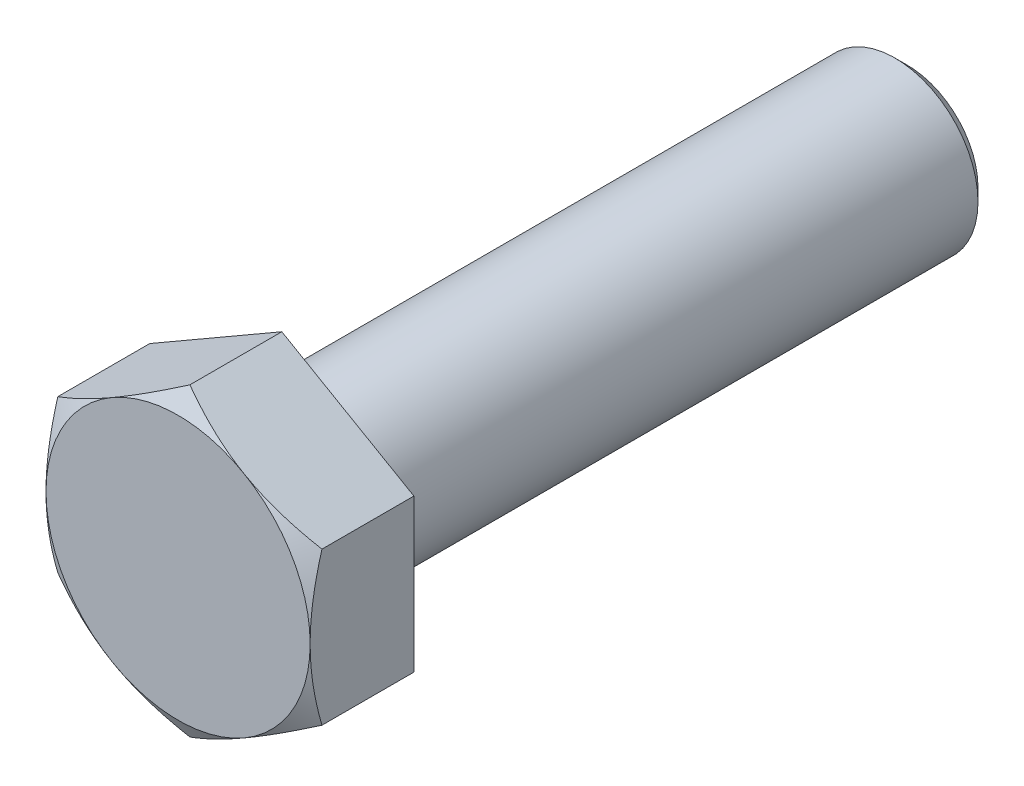
ISO-10303-21;
HEADER;
FILE_DESCRIPTION(('STEP AP214'),'2;1');
FILE_NAME('part.step','',(''),(''),'','','');
FILE_SCHEMA(('AUTOMOTIVE_DESIGN { 1 0 10303 214 1 1 1 1 }'));
ENDSEC;
DATA;
#1=APPLICATION_CONTEXT('core data for automotive mechanical design processes');
#2=APPLICATION_PROTOCOL_DEFINITION('international standard','automotive_design',2000,#1);
#3=PRODUCT_CONTEXT('',#1,'mechanical');
#4=PRODUCT('Part','Part','',(#3));
#5=PRODUCT_RELATED_PRODUCT_CATEGORY('part','',(#4));
#6=PRODUCT_DEFINITION_FORMATION('','',#4);
#7=PRODUCT_DEFINITION_CONTEXT('part definition',#1,'design');
#8=PRODUCT_DEFINITION('design','',#6,#7);
#9=PRODUCT_DEFINITION_SHAPE('','',#8);
#10=(LENGTH_UNIT() NAMED_UNIT(*) SI_UNIT(.MILLI.,.METRE.));
#11=(NAMED_UNIT(*) PLANE_ANGLE_UNIT() SI_UNIT($,.RADIAN.));
#12=(NAMED_UNIT(*) SI_UNIT($,.STERADIAN.) SOLID_ANGLE_UNIT());
#13=UNCERTAINTY_MEASURE_WITH_UNIT(LENGTH_MEASURE(1.E-05),#10,'distance_accuracy_value','');
#14=(GEOMETRIC_REPRESENTATION_CONTEXT(3) GLOBAL_UNCERTAINTY_ASSIGNED_CONTEXT((#13)) GLOBAL_UNIT_ASSIGNED_CONTEXT((#10,
#11,#12)) REPRESENTATION_CONTEXT('',''));
#15=CARTESIAN_POINT('',(0.,0.,0.));
#16=DIRECTION('',(0.,0.,1.));
#17=DIRECTION('',(1.,0.,0.));
#18=AXIS2_PLACEMENT_3D('',#15,#16,#17);
#19=CARTESIAN_POINT('',(0.,0.,0.));
#20=DIRECTION('',(0.,0.,1.));
#21=DIRECTION('',(1.,0.,0.));
#22=AXIS2_PLACEMENT_3D('',#19,#20,#21);
#23=PLANE('',#22);
#24=CARTESIAN_POINT('',(0.,0.,0.));
#25=DIRECTION('',(0.,0.,1.));
#26=DIRECTION('',(1.,0.,0.));
#27=AXIS2_PLACEMENT_3D('',#24,#25,#26);
#28=CIRCLE('',#27,4.6);
#29=CARTESIAN_POINT('',(4.6,0.,0.));
#30=VERTEX_POINT('',#29);
#31=EDGE_CURVE('E148',#30,#30,#28,.T.);
#32=ORIENTED_EDGE('',*,*,#31,.T.);
#33=EDGE_LOOP('',(#32));
#34=FACE_BOUND('',#33,.T.);
#35=CARTESIAN_POINT('',(0.,0.,0.));
#36=DIRECTION('',(0.,0.,1.));
#37=DIRECTION('',(1.,0.,0.));
#38=AXIS2_PLACEMENT_3D('',#35,#36,#37);
#39=CIRCLE('',#38,5.8);
#40=CARTESIAN_POINT('',(5.8,0.,0.));
#41=VERTEX_POINT('',#40);
#42=EDGE_CURVE('E294',#41,#41,#39,.T.);
#43=ORIENTED_EDGE('',*,*,#42,.F.);
#44=EDGE_LOOP('',(#43));
#45=FACE_BOUND('',#44,.T.);
#46=ADVANCED_FACE('F39',(#34,#45),#23,.F.);
#47=CARTESIAN_POINT('',(0.,0.,-0.6));
#48=DIRECTION('',(0.,0.,1.));
#49=DIRECTION('',(1.,0.,0.));
#50=AXIS2_PLACEMENT_3D('',#47,#48,#49);
#51=TOROIDAL_SURFACE('',#50,4.6,0.600000000000001);
#52=ORIENTED_EDGE('',*,*,#31,.F.);
#53=EDGE_LOOP('',(#52));
#54=FACE_BOUND('',#53,.T.);
#55=CARTESIAN_POINT('',(0.,0.,-0.6));
#56=DIRECTION('',(0.,0.,1.));
#57=DIRECTION('',(1.,0.,0.));
#58=AXIS2_PLACEMENT_3D('',#55,#56,#57);
#59=CIRCLE('',#58,4.);
#60=CARTESIAN_POINT('',(4.,0.,-0.6));
#61=VERTEX_POINT('',#60);
#62=EDGE_CURVE('E151',#61,#61,#59,.T.);
#63=ORIENTED_EDGE('',*,*,#62,.T.);
#64=EDGE_LOOP('',(#63));
#65=FACE_BOUND('',#64,.T.);
#66=ADVANCED_FACE('F235',(#54,#65),#51,.F.);
#67=CARTESIAN_POINT('',(0.,0.,0.));
#68=DIRECTION('',(0.,0.,1.));
#69=DIRECTION('',(1.,0.,0.));
#70=AXIS2_PLACEMENT_3D('',#67,#68,#69);
#71=CYLINDRICAL_SURFACE('',#70,4.);
#72=ORIENTED_EDGE('',*,*,#62,.F.);
#73=EDGE_LOOP('',(#72));
#74=FACE_BOUND('',#73,.T.);
#75=CARTESIAN_POINT('',(0.,0.,-29.4));
#76=DIRECTION('',(0.,0.,1.));
#77=DIRECTION('',(1.,0.,0.));
#78=AXIS2_PLACEMENT_3D('',#75,#76,#77);
#79=CIRCLE('',#78,4.);
#80=CARTESIAN_POINT('',(4.,0.,-29.4));
#81=VERTEX_POINT('',#80);
#82=EDGE_CURVE('E154',#81,#81,#79,.T.);
#83=ORIENTED_EDGE('',*,*,#82,.T.);
#84=EDGE_LOOP('',(#83));
#85=FACE_BOUND('',#84,.T.);
#86=ADVANCED_FACE('F241',(#74,#85),#71,.T.);
#87=CARTESIAN_POINT('',(0.,0.,-30.));
#88=DIRECTION('',(0.,0.,1.));
#89=DIRECTION('',(1.,0.,0.));
#90=AXIS2_PLACEMENT_3D('',#87,#88,#89);
#91=CONICAL_SURFACE('',#90,3.4,0.785398163397443);
#92=ORIENTED_EDGE('',*,*,#82,.F.);
#93=EDGE_LOOP('',(#92));
#94=FACE_BOUND('',#93,.T.);
#95=CARTESIAN_POINT('',(0.,0.,-30.));
#96=DIRECTION('',(0.,0.,1.));
#97=DIRECTION('',(1.,0.,0.));
#98=AXIS2_PLACEMENT_3D('',#95,#96,#97);
#99=CIRCLE('',#98,3.4);
#100=CARTESIAN_POINT('',(3.4,0.,-30.));
#101=VERTEX_POINT('',#100);
#102=EDGE_CURVE('E127',#101,#101,#99,.T.);
#103=ORIENTED_EDGE('',*,*,#102,.T.);
#104=EDGE_LOOP('',(#103));
#105=FACE_BOUND('',#104,.T.);
#106=ADVANCED_FACE('F308',(#94,#105),#91,.T.);
#107=CARTESIAN_POINT('',(0.,3.4,-30.));
#108=DIRECTION('',(0.,0.,1.));
#109=DIRECTION('',(1.,0.,0.));
#110=AXIS2_PLACEMENT_3D('',#107,#108,#109);
#111=PLANE('',#110);
#112=ORIENTED_EDGE('',*,*,#102,.F.);
#113=EDGE_LOOP('',(#112));
#114=FACE_BOUND('',#113,.T.);
#115=ADVANCED_FACE('F304',(#114),#111,.F.);
#116=CARTESIAN_POINT('',(0.,7.34966892678394,0.150000000000001));
#117=DIRECTION('',(0.,0.,-1.));
#118=DIRECTION('',(-1.,0.,0.));
#119=AXIS2_PLACEMENT_3D('',#116,#117,#118);
#120=PLANE('',#119);
#121=CARTESIAN_POINT('',(0.,0.,0.150000000000001));
#122=DIRECTION('',(0.,0.,1.));
#123=DIRECTION('',(1.,0.,0.));
#124=AXIS2_PLACEMENT_3D('',#121,#122,#123);
#125=CIRCLE('',#124,5.88660254037844);
#126=CARTESIAN_POINT('',(5.88660254037844,0.,0.150000000000001));
#127=VERTEX_POINT('',#126);
#128=EDGE_CURVE('E291',#127,#127,#125,.T.);
#129=ORIENTED_EDGE('',*,*,#128,.T.);
#130=EDGE_LOOP('',(#129));
#131=FACE_BOUND('',#130,.T.);
#132=DIRECTION('',(0.866025403784439,-0.5,0.));
#133=VECTOR('',#132,1.);
#134=CARTESIAN_POINT('',(6.365,3.67483446339197,0.150000000000001));
#135=LINE('',#134,#133);
#136=CARTESIAN_POINT('',(0.,7.34966892678394,0.150000000000001));
#137=VERTEX_POINT('',#136);
#138=CARTESIAN_POINT('',(6.365,3.67483446339197,0.150000000000003));
#139=VERTEX_POINT('',#138);
#140=EDGE_CURVE('E62',#137,#139,#135,.T.);
#141=ORIENTED_EDGE('',*,*,#140,.T.);
#142=DIRECTION('',(0.,-1.,0.));
#143=VECTOR('',#142,1.);
#144=CARTESIAN_POINT('',(6.365,-3.67483446339197,0.150000000000001));
#145=LINE('',#144,#143);
#146=CARTESIAN_POINT('',(6.365,-3.67483446339197,0.150000000000001));
#147=VERTEX_POINT('',#146);
#148=EDGE_CURVE('E11',#139,#147,#145,.T.);
#149=ORIENTED_EDGE('',*,*,#148,.T.);
#150=DIRECTION('',(-0.866025403784439,-0.5,0.));
#151=VECTOR('',#150,1.);
#152=CARTESIAN_POINT('',(0.,-7.34966892678394,0.150000000000001));
#153=LINE('',#152,#151);
#154=CARTESIAN_POINT('',(0.,-7.34966892678394,0.150000000000001));
#155=VERTEX_POINT('',#154);
#156=EDGE_CURVE('E162',#147,#155,#153,.T.);
#157=ORIENTED_EDGE('',*,*,#156,.T.);
#158=DIRECTION('',(-0.866025403784438,0.5,0.));
#159=VECTOR('',#158,1.);
#160=CARTESIAN_POINT('',(-6.365,-3.67483446339197,0.150000000000001));
#161=LINE('',#160,#159);
#162=CARTESIAN_POINT('',(-6.365,-3.67483446339197,0.150000000000001));
#163=VERTEX_POINT('',#162);
#164=EDGE_CURVE('E160',#155,#163,#161,.T.);
#165=ORIENTED_EDGE('',*,*,#164,.T.);
#166=DIRECTION('',(0.,1.,0.));
#167=VECTOR('',#166,1.);
#168=CARTESIAN_POINT('',(-6.365,3.67483446339197,0.150000000000001));
#169=LINE('',#168,#167);
#170=CARTESIAN_POINT('',(-6.365,3.67483446339197,0.150000000000001));
#171=VERTEX_POINT('',#170);
#172=EDGE_CURVE('E113',#163,#171,#169,.T.);
#173=ORIENTED_EDGE('',*,*,#172,.T.);
#174=DIRECTION('',(0.866025403784439,0.5,0.));
#175=VECTOR('',#174,1.);
#176=CARTESIAN_POINT('',(0.,7.34966892678394,0.150000000000001));
#177=LINE('',#176,#175);
#178=EDGE_CURVE('E110',#171,#137,#177,.T.);
#179=ORIENTED_EDGE('',*,*,#178,.T.);
#180=EDGE_LOOP('',(#141,#149,#157,#165,#173,#179));
#181=FACE_BOUND('',#180,.T.);
#182=ADVANCED_FACE('F111',(#131,#181),#120,.T.);
#183=CARTESIAN_POINT('',(0.,0.,0.150000000000001));
#184=DIRECTION('',(0.,0.,1.));
#185=DIRECTION('',(1.,0.,0.));
#186=AXIS2_PLACEMENT_3D('',#183,#184,#185);
#187=CONICAL_SURFACE('',#186,5.88660254037844,0.523598775598302);
#188=ORIENTED_EDGE('',*,*,#42,.T.);
#189=EDGE_LOOP('',(#188));
#190=FACE_BOUND('',#189,.T.);
#191=ORIENTED_EDGE('',*,*,#128,.F.);
#192=EDGE_LOOP('',(#191));
#193=FACE_BOUND('',#192,.T.);
#194=ADVANCED_FACE('F186',(#190,#193),#187,.T.);
#195=CARTESIAN_POINT('',(6.365,-3.67483446339197,5.15));
#196=DIRECTION('',(-1.,0.,0.));
#197=DIRECTION('',(0.,0.,1.));
#198=AXIS2_PLACEMENT_3D('',#195,#196,#197);
#199=PLANE('',#198);
#200=CARTESIAN_POINT('',(6.365,-9.74620255402201,2.10417752070094));
#201=CARTESIAN_POINT('',(6.365,-9.466743061924,2.23922778450705));
#202=CARTESIAN_POINT('',(6.365,-9.18662283336427,2.37293553637398));
#203=CARTESIAN_POINT('',(6.365,-8.62470364838083,2.63689885997667));
#204=CARTESIAN_POINT('',(6.365,-8.34290441151386,2.76715383400583));
#205=CARTESIAN_POINT('',(6.365,-7.77574769826275,3.02413063602513));
#206=CARTESIAN_POINT('',(6.365,-7.49037908790233,3.15082797964364));
#207=CARTESIAN_POINT('',(6.365,-6.91729637209056,3.39878070466244));
#208=CARTESIAN_POINT('',(6.365,-6.62958238982508,3.52003636972724));
#209=CARTESIAN_POINT('',(6.365,-6.04777966328442,3.75709828240193));
#210=CARTESIAN_POINT('',(6.365,-5.75365602159666,3.87281935215871));
#211=CARTESIAN_POINT('',(6.365,-5.16193930006325,4.09519817931673));
#212=CARTESIAN_POINT('',(6.365,-4.864345838395,4.20185492835972));
#213=CARTESIAN_POINT('',(6.365,-4.26582830474239,4.40323957299992));
#214=CARTESIAN_POINT('',(6.365,-3.96491285237291,4.49799282927845));
#215=CARTESIAN_POINT('',(6.365,-3.35880092538506,4.67249210660028));
#216=CARTESIAN_POINT('',(6.365,-3.05360583750632,4.75224287346636));
#217=CARTESIAN_POINT('',(6.365,-2.43874088628671,4.89286958916527));
#218=CARTESIAN_POINT('',(6.365,-2.12906985440494,4.95374051233359));
#219=CARTESIAN_POINT('',(6.365,-1.50595084883236,5.05249385747353));
#220=CARTESIAN_POINT('',(6.365,-1.19250287180248,5.0903762591204));
#221=CARTESIAN_POINT('',(6.365,-0.721832091587364,5.12753002038573));
#222=CARTESIAN_POINT('',(6.365,-0.565346043942451,5.13663818585123));
#223=CARTESIAN_POINT('',(6.365,-0.252121475645645,5.14822358924696));
#224=CARTESIAN_POINT('',(6.365,-0.0953829582988819,5.15070091328813));
#225=CARTESIAN_POINT('',(6.365,0.218011475278279,5.14895808707227));
#226=CARTESIAN_POINT('',(6.365,0.374667402345121,5.14473981644265));
#227=CARTESIAN_POINT('',(6.365,0.687665429465812,5.12971270573269));
#228=CARTESIAN_POINT('',(6.365,0.844007513456339,5.11890353652779));
#229=CARTESIAN_POINT('',(6.365,1.22293245370947,5.08494297431608));
#230=CARTESIAN_POINT('',(6.365,1.445224118384,5.05848904503914));
#231=CARTESIAN_POINT('',(6.365,1.88810410746324,4.99372467120738));
#232=CARTESIAN_POINT('',(6.365,2.10869195007896,4.95541099043317));
#233=CARTESIAN_POINT('',(6.365,2.547982235728,4.86828591240334));
#234=CARTESIAN_POINT('',(6.365,2.76668269133519,4.81946458949066));
#235=CARTESIAN_POINT('',(6.365,3.20183348991462,4.71281384098773));
#236=CARTESIAN_POINT('',(6.365,3.4182840428113,4.65498526400403));
#237=CARTESIAN_POINT('',(6.365,3.85426615972079,4.53019185361869));
#238=CARTESIAN_POINT('',(6.365,4.07374319251582,4.46303781689891));
#239=CARTESIAN_POINT('',(6.365,4.51037738064171,4.32209453671705));
#240=CARTESIAN_POINT('',(6.365,4.72753602208682,4.24830986982301));
#241=CARTESIAN_POINT('',(6.365,5.15866204869267,4.09562942366593));
#242=CARTESIAN_POINT('',(6.365,5.37264051637927,4.01676475081889));
#243=CARTESIAN_POINT('',(6.365,5.79893727559048,3.85440649793558));
#244=CARTESIAN_POINT('',(6.365,6.01125485600018,3.77091104705295));
#245=CARTESIAN_POINT('',(6.365,6.22280111012558,3.68555829334041));
#246=B_SPLINE_CURVE_WITH_KNOTS('',3,(#200,#201,#202,#203,#204,#205,#206,#207,#208,#209,#210,
#211,#212,#213,#214,#215,#216,#217,#218,#219,#220,#221,#222,#223,#224,#225,#226,#227,#228,#229,
#230,#231,#232,#233,#234,#235,#236,#237,#238,#239,#240,#241,#242,#243,#244,#245),.UNSPECIFIED.,
.F.,.F.,(4,2,2,2,2,2,2,2,2,2,2,2,2,2,2,2,2,2,2,2,2,2,4),(0.,0.931154614866976,1.86246938194105,
2.79911368730425,3.73570911030725,4.68380301837242,5.63200225923999,6.57814578450031,
7.52398950564165,8.47008478721693,9.41618090525813,9.88631422449017,10.3564414383406,
10.8264366986048,11.2964554305782,11.9676621628092,12.6390522116941,13.3110792699478,
13.9830430523123,14.6714781192221,15.3594416141426,16.0435327883289,16.7279023793783),.UNSPECIFIED.);
#247=CARTESIAN_POINT('',(6.365,-3.67483446339197,4.58150113005864));
#248=VERTEX_POINT('',#247);
#249=CARTESIAN_POINT('',(6.365,0.,5.15));
#250=VERTEX_POINT('',#249);
#251=EDGE_CURVE('E289',#248,#250,#246,.T.);
#252=ORIENTED_EDGE('',*,*,#251,.F.);
#253=DIRECTION('',(0.,0.,-1.));
#254=VECTOR('',#253,1.);
#255=CARTESIAN_POINT('',(6.365,-3.67483446339197,5.15));
#256=LINE('',#255,#254);
#257=EDGE_CURVE('E144',#248,#147,#256,.T.);
#258=ORIENTED_EDGE('',*,*,#257,.T.);
#259=ORIENTED_EDGE('',*,*,#148,.F.);
#260=DIRECTION('',(0.,0.,-1.));
#261=VECTOR('',#260,1.);
#262=CARTESIAN_POINT('',(6.365,3.67483446339197,5.15));
#263=LINE('',#262,#261);
#264=CARTESIAN_POINT('',(6.365,3.67483446339197,4.58150113005864));
#265=VERTEX_POINT('',#264);
#266=EDGE_CURVE('E126',#265,#139,#263,.T.);
#267=ORIENTED_EDGE('',*,*,#266,.F.);
#268=EDGE_CURVE('E191',#250,#265,#246,.T.);
#269=ORIENTED_EDGE('',*,*,#268,.F.);
#270=EDGE_LOOP('',(#252,#258,#259,#267,#269));
#271=FACE_BOUND('',#270,.T.);
#272=ADVANCED_FACE('F246',(#271),#199,.F.);
#273=CARTESIAN_POINT('',(0.,-7.34966892678394,5.15));
#274=DIRECTION('',(-0.5,0.866025403784439,0.));
#275=DIRECTION('',(-0.866025403784439,-0.5,0.));
#276=AXIS2_PLACEMENT_3D('',#273,#274,#275);
#277=PLANE('',#276);
#278=CARTESIAN_POINT('',(-0.000200000000001205,-7.34978439683778,4.58143446182091));
#279=CARTESIAN_POINT('',(0.139710039115643,-7.26900729809203,4.6280643413956));
#280=CARTESIAN_POINT('',(0.280141730709852,-7.18792902314736,4.67257800061253));
#281=CARTESIAN_POINT('',(0.562145571657772,-7.02511402966357,4.75679002639063));
#282=CARTESIAN_POINT('',(0.703718185116129,-6.94337704317351,4.79648631569877));
#283=CARTESIAN_POINT('',(1.13070279037378,-6.69685736638818,4.90756995845888));
#284=CARTESIAN_POINT('',(1.41780023937635,-6.53110157692289,4.97075318530501));
#285=CARTESIAN_POINT('',(1.84743635075536,-6.28305105236463,5.04484317711931));
#286=CARTESIAN_POINT('',(1.9886912977997,-6.20149747066421,5.0659493132145));
#287=CARTESIAN_POINT('',(2.27183945542866,-6.03802180563659,5.10134132834389));
#288=CARTESIAN_POINT('',(2.41373260850058,-5.95609975551435,5.11562780998361));
#289=CARTESIAN_POINT('',(2.6977653589495,-5.792113370584,5.13701642089907));
#290=CARTESIAN_POINT('',(2.83990449241902,-5.71004930361299,5.1441267036469));
#291=CARTESIAN_POINT('',(3.12430622079744,-5.54584988917571,5.15101808099618));
#292=CARTESIAN_POINT('',(3.26656881175663,-5.46371454398981,5.15079940200902));
#293=CARTESIAN_POINT('',(3.65632359139324,-5.23868951704867,5.14012613527418));
#294=CARTESIAN_POINT('',(3.90368820112705,-5.09587349303087,5.1222078418454));
#295=CARTESIAN_POINT('',(4.39677444253791,-4.81119001881861,5.06538838058255));
#296=CARTESIAN_POINT('',(4.64249434006573,-4.66932356983568,5.02646779156689));
#297=CARTESIAN_POINT('',(5.13657294389504,-4.38406715491399,4.92917745645478));
#298=CARTESIAN_POINT('',(5.38486930573046,-4.24071318356951,4.87039549497283));
#299=CARTESIAN_POINT('',(5.87775919646686,-3.956143072472,4.73698409890944));
#300=CARTESIAN_POINT('',(6.12235903782157,-3.81492328822212,4.66238600278679));
#301=CARTESIAN_POINT('',(6.3652,-3.67471899333814,4.58143446182091));
#302=B_SPLINE_CURVE_WITH_KNOTS('',3,(#278,#279,#280,#281,#282,#283,#284,#285,#286,#287,#288,
#289,#290,#291,#292,#293,#294,#295,#296,#297,#298,#299,#300,#301),.UNSPECIFIED.,.F.,.F.,(4,2,2,
2,2,2,2,2,2,2,2,4),(0.,0.504406880784759,1.00903049509045,2.02037460639605,2.51366063649745,
3.00690307026488,3.49958445754648,3.99225062458519,4.84993121388198,5.70840627760013,
6.58592135712847,7.46171369114761),.UNSPECIFIED.);
#303=CARTESIAN_POINT('',(0.,-7.34966892678394,4.58150113005864));
#304=VERTEX_POINT('',#303);
#305=CARTESIAN_POINT('',(3.1825,-5.51225169508795,5.15));
#306=VERTEX_POINT('',#305);
#307=EDGE_CURVE('E260',#304,#306,#302,.T.);
#308=ORIENTED_EDGE('',*,*,#307,.F.);
#309=DIRECTION('',(0.,0.,-1.));
#310=VECTOR('',#309,1.);
#311=CARTESIAN_POINT('',(0.,-7.34966892678394,5.15));
#312=LINE('',#311,#310);
#313=EDGE_CURVE('E141',#304,#155,#312,.T.);
#314=ORIENTED_EDGE('',*,*,#313,.T.);
#315=ORIENTED_EDGE('',*,*,#156,.F.);
#316=ORIENTED_EDGE('',*,*,#257,.F.);
#317=EDGE_CURVE('E201',#306,#248,#302,.T.);
#318=ORIENTED_EDGE('',*,*,#317,.F.);
#319=EDGE_LOOP('',(#308,#314,#315,#316,#318));
#320=FACE_BOUND('',#319,.T.);
#321=ADVANCED_FACE('F249',(#320),#277,.F.);
#322=CARTESIAN_POINT('',(-6.365,-3.67483446339197,5.15));
#323=DIRECTION('',(0.5,0.866025403784439,0.));
#324=DIRECTION('',(-0.866025403784438,0.5,0.));
#325=AXIS2_PLACEMENT_3D('',#322,#323,#324);
#326=PLANE('',#325);
#327=CARTESIAN_POINT('',(-6.3652,-3.67471899333813,4.58143446182091));
#328=CARTESIAN_POINT('',(-6.22528996088436,-3.75549609208388,4.6280643413956));
#329=CARTESIAN_POINT('',(-6.08485826929015,-3.83657436702855,4.67257800061253));
#330=CARTESIAN_POINT('',(-5.80285442834223,-3.99938936051234,4.75679002639063));
#331=CARTESIAN_POINT('',(-5.66128181488387,-4.0811263470024,4.79648631569877));
#332=CARTESIAN_POINT('',(-5.23429720962622,-4.32764602378773,4.90756995845888));
#333=CARTESIAN_POINT('',(-4.94719976062365,-4.49340181325302,4.97075318530501));
#334=CARTESIAN_POINT('',(-4.51756364924464,-4.74145233781128,5.04484317711931));
#335=CARTESIAN_POINT('',(-4.3763087022003,-4.82300591951169,5.0659493132145));
#336=CARTESIAN_POINT('',(-4.09316054457134,-4.98648158453932,5.10134132834389));
#337=CARTESIAN_POINT('',(-3.95126739149942,-5.06840363466156,5.11562780998361));
#338=CARTESIAN_POINT('',(-3.6672346410505,-5.23239001959191,5.13701642089907));
#339=CARTESIAN_POINT('',(-3.52509550758098,-5.31445408656292,5.1441267036469));
#340=CARTESIAN_POINT('',(-3.24069377920256,-5.47865350100019,5.15101808099618));
#341=CARTESIAN_POINT('',(-3.09843118824337,-5.5607888461861,5.15079940200902));
#342=CARTESIAN_POINT('',(-2.70867640860676,-5.78581387312724,5.14012613527418));
#343=CARTESIAN_POINT('',(-2.46131179887295,-5.92862989714504,5.1222078418454));
#344=CARTESIAN_POINT('',(-1.96822555746209,-6.2133133713573,5.06538838058255));
#345=CARTESIAN_POINT('',(-1.72250565993427,-6.35517982034023,5.02646779156689));
#346=CARTESIAN_POINT('',(-1.22842705610496,-6.64043623526192,4.92917745645478));
#347=CARTESIAN_POINT('',(-0.980130694269542,-6.78379020660641,4.87039549497283));
#348=CARTESIAN_POINT('',(-0.487240803533137,-7.06836031770391,4.73698409890944));
#349=CARTESIAN_POINT('',(-0.242640962178432,-7.20958010195379,4.66238600278679));
#350=CARTESIAN_POINT('',(0.000199999999998262,-7.34978439683778,4.58143446182091));
#351=B_SPLINE_CURVE_WITH_KNOTS('',3,(#327,#328,#329,#330,#331,#332,#333,#334,#335,#336,#337,
#338,#339,#340,#341,#342,#343,#344,#345,#346,#347,#348,#349,#350),.UNSPECIFIED.,.F.,.F.,(4,2,2,
2,2,2,2,2,2,2,2,4),(0.,0.504406880784758,1.00903049509045,2.02037460639605,2.51366063649744,
3.00690307026488,3.49958445754648,3.99225062458519,4.84993121388198,5.70840627760013,
6.58592135712847,7.46171369114762),.UNSPECIFIED.);
#352=CARTESIAN_POINT('',(-6.365,-3.67483446339197,4.58150113005864));
#353=VERTEX_POINT('',#352);
#354=CARTESIAN_POINT('',(-3.1825,-5.51225169508795,5.15));
#355=VERTEX_POINT('',#354);
#356=EDGE_CURVE('E222',#353,#355,#351,.T.);
#357=ORIENTED_EDGE('',*,*,#356,.F.);
#358=DIRECTION('',(0.,0.,-1.));
#359=VECTOR('',#358,1.);
#360=CARTESIAN_POINT('',(-6.365,-3.67483446339197,5.15));
#361=LINE('',#360,#359);
#362=EDGE_CURVE('E136',#353,#163,#361,.T.);
#363=ORIENTED_EDGE('',*,*,#362,.T.);
#364=ORIENTED_EDGE('',*,*,#164,.F.);
#365=ORIENTED_EDGE('',*,*,#313,.F.);
#366=EDGE_CURVE('E209',#355,#304,#351,.T.);
#367=ORIENTED_EDGE('',*,*,#366,.F.);
#368=EDGE_LOOP('',(#357,#363,#364,#365,#367));
#369=FACE_BOUND('',#368,.T.);
#370=ADVANCED_FACE('F226',(#369),#326,.F.);
#371=CARTESIAN_POINT('',(-6.365,3.67483446339197,5.15));
#372=DIRECTION('',(1.,0.,0.));
#373=DIRECTION('',(0.,0.,-1.));
#374=AXIS2_PLACEMENT_3D('',#371,#372,#373);
#375=PLANE('',#374);
#376=CARTESIAN_POINT('',(-6.365,-9.74620255402201,2.10417752070094));
#377=CARTESIAN_POINT('',(-6.365,-9.466743061924,2.23922778450705));
#378=CARTESIAN_POINT('',(-6.365,-9.18662283336426,2.37293553637398));
#379=CARTESIAN_POINT('',(-6.365,-8.62470364838082,2.63689885997667));
#380=CARTESIAN_POINT('',(-6.365,-8.34290441151386,2.76715383400583));
#381=CARTESIAN_POINT('',(-6.365,-7.77574769826275,3.02413063602514));
#382=CARTESIAN_POINT('',(-6.365,-7.49037908790233,3.15082797964364));
#383=CARTESIAN_POINT('',(-6.365,-6.91729637209055,3.39878070466244));
#384=CARTESIAN_POINT('',(-6.365,-6.62958238982508,3.52003636972724));
#385=CARTESIAN_POINT('',(-6.365,-6.04777966328442,3.75709828240193));
#386=CARTESIAN_POINT('',(-6.365,-5.75365602159666,3.87281935215871));
#387=CARTESIAN_POINT('',(-6.365,-5.16193930006325,4.09519817931673));
#388=CARTESIAN_POINT('',(-6.365,-4.864345838395,4.20185492835972));
#389=CARTESIAN_POINT('',(-6.365,-4.26582830474239,4.40323957299992));
#390=CARTESIAN_POINT('',(-6.365,-3.96491285237291,4.49799282927845));
#391=CARTESIAN_POINT('',(-6.365,-3.35880092538506,4.67249210660028));
#392=CARTESIAN_POINT('',(-6.365,-3.05360583750632,4.75224287346636));
#393=CARTESIAN_POINT('',(-6.365,-2.4387408862867,4.89286958916527));
#394=CARTESIAN_POINT('',(-6.365,-2.12906985440494,4.95374051233359));
#395=CARTESIAN_POINT('',(-6.365,-1.50595084883235,5.05249385747353));
#396=CARTESIAN_POINT('',(-6.365,-1.19250287180248,5.0903762591204));
#397=CARTESIAN_POINT('',(-6.365,-0.72183209158736,5.12753002038573));
#398=CARTESIAN_POINT('',(-6.365,-0.565346043942447,5.13663818585123));
#399=CARTESIAN_POINT('',(-6.365,-0.252121475645641,5.14822358924696));
#400=CARTESIAN_POINT('',(-6.365,-0.0953829582988774,5.15070091328813));
#401=CARTESIAN_POINT('',(-6.365,0.218011475278284,5.14895808707227));
#402=CARTESIAN_POINT('',(-6.365,0.374667402345125,5.14473981644265));
#403=CARTESIAN_POINT('',(-6.365,0.687665429465816,5.12971270573269));
#404=CARTESIAN_POINT('',(-6.365,0.844007513456343,5.11890353652778));
#405=CARTESIAN_POINT('',(-6.365,1.22293245370947,5.08494297431608));
#406=CARTESIAN_POINT('',(-6.365,1.445224118384,5.05848904503914));
#407=CARTESIAN_POINT('',(-6.365,1.88810410746324,4.99372467120738));
#408=CARTESIAN_POINT('',(-6.365,2.10869195007897,4.95541099043317));
#409=CARTESIAN_POINT('',(-6.365,2.547982235728,4.86828591240333));
#410=CARTESIAN_POINT('',(-6.365,2.76668269133519,4.81946458949066));
#411=CARTESIAN_POINT('',(-6.365,3.20183348991463,4.71281384098773));
#412=CARTESIAN_POINT('',(-6.365,3.4182840428113,4.65498526400403));
#413=CARTESIAN_POINT('',(-6.365,3.85426615972079,4.53019185361869));
#414=CARTESIAN_POINT('',(-6.365,4.07374319251583,4.46303781689891));
#415=CARTESIAN_POINT('',(-6.365,4.51037738064171,4.32209453671705));
#416=CARTESIAN_POINT('',(-6.365,4.72753602208683,4.24830986982301));
#417=CARTESIAN_POINT('',(-6.365,5.15866204869268,4.09562942366593));
#418=CARTESIAN_POINT('',(-6.365,5.37264051637928,4.01676475081889));
#419=CARTESIAN_POINT('',(-6.365,5.79893727559049,3.85440649793558));
#420=CARTESIAN_POINT('',(-6.365,6.01125485600019,3.77091104705294));
#421=CARTESIAN_POINT('',(-6.365,6.22280111012559,3.6855582933404));
#422=B_SPLINE_CURVE_WITH_KNOTS('',3,(#376,#377,#378,#379,#380,#381,#382,#383,#384,#385,#386,
#387,#388,#389,#390,#391,#392,#393,#394,#395,#396,#397,#398,#399,#400,#401,#402,#403,#404,#405,
#406,#407,#408,#409,#410,#411,#412,#413,#414,#415,#416,#417,#418,#419,#420,#421),.UNSPECIFIED.,
.F.,.F.,(4,2,2,2,2,2,2,2,2,2,2,2,2,2,2,2,2,2,2,2,2,2,4),(0.,0.931154614866975,1.86246938194105,
2.79911368730425,3.73570911030724,4.68380301837242,5.63200225923999,6.57814578450031,
7.52398950564165,8.47008478721693,9.41618090525813,9.88631422449017,10.3564414383406,
10.8264366986048,11.2964554305782,11.9676621628092,12.6390522116941,13.3110792699478,
13.9830430523123,14.6714781192221,15.3594416141426,16.0435327883289,16.7279023793783),.UNSPECIFIED.);
#423=CARTESIAN_POINT('',(-6.365,3.67483446339197,4.58150113005864));
#424=VERTEX_POINT('',#423);
#425=CARTESIAN_POINT('',(-6.365,0.,5.15));
#426=VERTEX_POINT('',#425);
#427=EDGE_CURVE('E221',#424,#426,#422,.F.);
#428=ORIENTED_EDGE('',*,*,#427,.F.);
#429=DIRECTION('',(0.,0.,-1.));
#430=VECTOR('',#429,1.);
#431=CARTESIAN_POINT('',(-6.365,3.67483446339197,5.15));
#432=LINE('',#431,#430);
#433=EDGE_CURVE('E133',#424,#171,#432,.T.);
#434=ORIENTED_EDGE('',*,*,#433,.T.);
#435=ORIENTED_EDGE('',*,*,#172,.F.);
#436=ORIENTED_EDGE('',*,*,#362,.F.);
#437=EDGE_CURVE('E215',#426,#353,#422,.F.);
#438=ORIENTED_EDGE('',*,*,#437,.F.);
#439=EDGE_LOOP('',(#428,#434,#435,#436,#438));
#440=FACE_BOUND('',#439,.T.);
#441=ADVANCED_FACE('F223',(#440),#375,.F.);
#442=CARTESIAN_POINT('',(0.,7.34966892678394,5.15));
#443=DIRECTION('',(0.5,-0.866025403784439,0.));
#444=DIRECTION('',(0.866025403784439,0.5,0.));
#445=AXIS2_PLACEMENT_3D('',#442,#443,#444);
#446=PLANE('',#445);
#447=CARTESIAN_POINT('',(0.000200000000001834,7.34978439683777,4.58143446182091));
#448=CARTESIAN_POINT('',(-0.139710039115642,7.26900729809203,4.6280643413956));
#449=CARTESIAN_POINT('',(-0.280141730709851,7.18792902314735,4.67257800061253));
#450=CARTESIAN_POINT('',(-0.562145571657771,7.02511402966357,4.75679002639063));
#451=CARTESIAN_POINT('',(-0.703718185116128,6.9433770431735,4.79648631569878));
#452=CARTESIAN_POINT('',(-1.13070279037378,6.69685736638817,4.90756995845888));
#453=CARTESIAN_POINT('',(-1.41780023937635,6.53110157692288,4.97075318530501));
#454=CARTESIAN_POINT('',(-1.84743635075535,6.28305105236463,5.04484317711932));
#455=CARTESIAN_POINT('',(-1.9886912977997,6.20149747066421,5.0659493132145));
#456=CARTESIAN_POINT('',(-2.27183945542866,6.03802180563659,5.10134132834389));
#457=CARTESIAN_POINT('',(-2.41373260850058,5.95609975551435,5.11562780998362));
#458=CARTESIAN_POINT('',(-2.69776535894949,5.792113370584,5.13701642089907));
#459=CARTESIAN_POINT('',(-2.83990449241902,5.71004930361299,5.14412670364691));
#460=CARTESIAN_POINT('',(-3.12430622079744,5.54584988917571,5.15101808099618));
#461=CARTESIAN_POINT('',(-3.26656881175663,5.46371454398981,5.15079940200902));
#462=CARTESIAN_POINT('',(-3.65632359139324,5.23868951704867,5.14012613527418));
#463=CARTESIAN_POINT('',(-3.90368820112705,5.09587349303087,5.1222078418454));
#464=CARTESIAN_POINT('',(-4.3967744425379,4.81119001881861,5.06538838058255));
#465=CARTESIAN_POINT('',(-4.64249434006573,4.66932356983568,5.0264677915669));
#466=CARTESIAN_POINT('',(-5.13657294389504,4.38406715491398,4.92917745645479));
#467=CARTESIAN_POINT('',(-5.38486930573046,4.2407131835695,4.87039549497283));
#468=CARTESIAN_POINT('',(-5.87775919646686,3.95614307247199,4.73698409890945));
#469=CARTESIAN_POINT('',(-6.12235903782157,3.81492328822211,4.66238600278679));
#470=CARTESIAN_POINT('',(-6.3652,3.67471899333813,4.58143446182091));
#471=B_SPLINE_CURVE_WITH_KNOTS('',3,(#447,#448,#449,#450,#451,#452,#453,#454,#455,#456,#457,
#458,#459,#460,#461,#462,#463,#464,#465,#466,#467,#468,#469,#470),.UNSPECIFIED.,.F.,.F.,(4,2,2,
2,2,2,2,2,2,2,2,4),(0.,0.504406880784759,1.00903049509045,2.02037460639605,2.51366063649744,
3.00690307026487,3.49958445754648,3.99225062458519,4.84993121388198,5.70840627760013,
6.58592135712847,7.46171369114762),.UNSPECIFIED.);
#472=CARTESIAN_POINT('',(0.,7.34966892678394,4.58150113005864));
#473=VERTEX_POINT('',#472);
#474=CARTESIAN_POINT('',(-3.1825,5.51225169508795,5.15));
#475=VERTEX_POINT('',#474);
#476=EDGE_CURVE('E132',#473,#475,#471,.T.);
#477=ORIENTED_EDGE('',*,*,#476,.F.);
#478=DIRECTION('',(0.,0.,-1.));
#479=VECTOR('',#478,1.);
#480=CARTESIAN_POINT('',(0.,7.34966892678394,5.15));
#481=LINE('',#480,#479);
#482=EDGE_CURVE('E124',#473,#137,#481,.T.);
#483=ORIENTED_EDGE('',*,*,#482,.T.);
#484=ORIENTED_EDGE('',*,*,#178,.F.);
#485=ORIENTED_EDGE('',*,*,#433,.F.);
#486=EDGE_CURVE('E172',#475,#424,#471,.T.);
#487=ORIENTED_EDGE('',*,*,#486,.F.);
#488=EDGE_LOOP('',(#477,#483,#484,#485,#487));
#489=FACE_BOUND('',#488,.T.);
#490=ADVANCED_FACE('F130',(#489),#446,.F.);
#491=CARTESIAN_POINT('',(6.365,3.67483446339197,5.15));
#492=DIRECTION('',(-0.5,-0.866025403784439,0.));
#493=DIRECTION('',(0.866025403784439,-0.5,0.));
#494=AXIS2_PLACEMENT_3D('',#491,#492,#493);
#495=PLANE('',#494);
#496=CARTESIAN_POINT('',(6.3652,3.67471899333813,4.58143446182091));
#497=CARTESIAN_POINT('',(6.22528996088436,3.75549609208388,4.6280643413956));
#498=CARTESIAN_POINT('',(6.08485826929015,3.83657436702855,4.67257800061253));
#499=CARTESIAN_POINT('',(5.80285442834223,3.99938936051234,4.75679002639063));
#500=CARTESIAN_POINT('',(5.66128181488387,4.0811263470024,4.79648631569877));
#501=CARTESIAN_POINT('',(5.23429720962622,4.32764602378773,4.90756995845888));
#502=CARTESIAN_POINT('',(4.94719976062365,4.49340181325302,4.97075318530501));
#503=CARTESIAN_POINT('',(4.51756364924464,4.74145233781128,5.04484317711932));
#504=CARTESIAN_POINT('',(4.3763087022003,4.82300591951169,5.0659493132145));
#505=CARTESIAN_POINT('',(4.09316054457134,4.98648158453932,5.10134132834389));
#506=CARTESIAN_POINT('',(3.95126739149941,5.06840363466156,5.11562780998361));
#507=CARTESIAN_POINT('',(3.6672346410505,5.23239001959191,5.13701642089907));
#508=CARTESIAN_POINT('',(3.52509550758098,5.31445408656292,5.1441267036469));
#509=CARTESIAN_POINT('',(3.24069377920256,5.47865350100019,5.15101808099618));
#510=CARTESIAN_POINT('',(3.09843118824337,5.5607888461861,5.15079940200902));
#511=CARTESIAN_POINT('',(2.70867640860676,5.78581387312724,5.14012613527418));
#512=CARTESIAN_POINT('',(2.46131179887295,5.92862989714504,5.1222078418454));
#513=CARTESIAN_POINT('',(1.96822555746209,6.2133133713573,5.06538838058255));
#514=CARTESIAN_POINT('',(1.72250565993427,6.35517982034023,5.02646779156689));
#515=CARTESIAN_POINT('',(1.22842705610496,6.64043623526192,4.92917745645479));
#516=CARTESIAN_POINT('',(0.980130694269541,6.7837902066064,4.87039549497283));
#517=CARTESIAN_POINT('',(0.487240803533137,7.06836031770391,4.73698409890944));
#518=CARTESIAN_POINT('',(0.242640962178432,7.20958010195379,4.66238600278679));
#519=CARTESIAN_POINT('',(-0.000199999999998938,7.34978439683777,4.58143446182091));
#520=B_SPLINE_CURVE_WITH_KNOTS('',3,(#496,#497,#498,#499,#500,#501,#502,#503,#504,#505,#506,
#507,#508,#509,#510,#511,#512,#513,#514,#515,#516,#517,#518,#519),.UNSPECIFIED.,.F.,.F.,(4,2,2,
2,2,2,2,2,2,2,2,4),(0.,0.504406880784758,1.00903049509045,2.02037460639605,2.51366063649745,
3.00690307026488,3.49958445754648,3.99225062458519,4.84993121388198,5.70840627760013,
6.58592135712847,7.46171369114761),.UNSPECIFIED.);
#521=CARTESIAN_POINT('',(3.1825,5.51225169508795,5.15));
#522=VERTEX_POINT('',#521);
#523=EDGE_CURVE('E164',#265,#522,#520,.T.);
#524=ORIENTED_EDGE('',*,*,#523,.F.);
#525=ORIENTED_EDGE('',*,*,#266,.T.);
#526=ORIENTED_EDGE('',*,*,#140,.F.);
#527=ORIENTED_EDGE('',*,*,#482,.F.);
#528=EDGE_CURVE('E165',#522,#473,#520,.T.);
#529=ORIENTED_EDGE('',*,*,#528,.F.);
#530=EDGE_LOOP('',(#524,#525,#526,#527,#529));
#531=FACE_BOUND('',#530,.T.);
#532=ADVANCED_FACE('F41',(#531),#495,.F.);
#533=CARTESIAN_POINT('',(0.,0.,5.15));
#534=DIRECTION('',(0.,0.,-1.));
#535=DIRECTION('',(-1.,0.,0.));
#536=AXIS2_PLACEMENT_3D('',#533,#534,#535);
#537=CONICAL_SURFACE('',#536,6.365,1.0471975511966);
#538=ORIENTED_EDGE('',*,*,#317,.T.);
#539=ORIENTED_EDGE('',*,*,#251,.T.);
#540=CARTESIAN_POINT('',(0.,0.,5.15));
#541=DIRECTION('',(0.,0.,1.));
#542=DIRECTION('',(1.,0.,0.));
#543=AXIS2_PLACEMENT_3D('',#540,#541,#542);
#544=CIRCLE('',#543,6.365);
#545=EDGE_CURVE('E55',#306,#250,#544,.T.);
#546=ORIENTED_EDGE('',*,*,#545,.F.);
#547=EDGE_LOOP('',(#538,#539,#546));
#548=FACE_BOUND('',#547,.T.);
#549=ADVANCED_FACE('F185',(#548),#537,.T.);
#550=ORIENTED_EDGE('',*,*,#366,.T.);
#551=ORIENTED_EDGE('',*,*,#307,.T.);
#552=EDGE_CURVE('E135',#355,#306,#544,.T.);
#553=ORIENTED_EDGE('',*,*,#552,.F.);
#554=EDGE_LOOP('',(#550,#551,#553));
#555=FACE_BOUND('',#554,.T.);
#556=ADVANCED_FACE('F391',(#555),#537,.T.);
#557=ORIENTED_EDGE('',*,*,#437,.T.);
#558=ORIENTED_EDGE('',*,*,#356,.T.);
#559=EDGE_CURVE('E281',#426,#355,#544,.T.);
#560=ORIENTED_EDGE('',*,*,#559,.F.);
#561=EDGE_LOOP('',(#557,#558,#560));
#562=FACE_BOUND('',#561,.T.);
#563=ADVANCED_FACE('F282',(#562),#537,.T.);
#564=ORIENTED_EDGE('',*,*,#486,.T.);
#565=ORIENTED_EDGE('',*,*,#427,.T.);
#566=EDGE_CURVE('E277',#475,#426,#544,.T.);
#567=ORIENTED_EDGE('',*,*,#566,.F.);
#568=EDGE_LOOP('',(#564,#565,#567));
#569=FACE_BOUND('',#568,.T.);
#570=ADVANCED_FACE('F275',(#569),#537,.T.);
#571=ORIENTED_EDGE('',*,*,#528,.T.);
#572=ORIENTED_EDGE('',*,*,#476,.T.);
#573=EDGE_CURVE('E48',#522,#475,#544,.T.);
#574=ORIENTED_EDGE('',*,*,#573,.F.);
#575=EDGE_LOOP('',(#571,#572,#574));
#576=FACE_BOUND('',#575,.T.);
#577=ADVANCED_FACE('F183',(#576),#537,.T.);
#578=ORIENTED_EDGE('',*,*,#523,.T.);
#579=CARTESIAN_POINT('',(0.,0.,5.15));
#580=DIRECTION('',(0.,0.,1.));
#581=DIRECTION('',(1.,0.,0.));
#582=AXIS2_PLACEMENT_3D('',#579,#580,#581);
#583=CIRCLE('',#582,6.365);
#584=EDGE_CURVE('E285',#250,#522,#583,.T.);
#585=ORIENTED_EDGE('',*,*,#584,.F.);
#586=ORIENTED_EDGE('',*,*,#268,.T.);
#587=EDGE_LOOP('',(#578,#585,#586));
#588=FACE_BOUND('',#587,.T.);
#589=ADVANCED_FACE('F178',(#588),#537,.T.);
#590=CARTESIAN_POINT('',(0.,0.,5.15));
#591=DIRECTION('',(0.,0.,1.));
#592=DIRECTION('',(1.,0.,0.));
#593=AXIS2_PLACEMENT_3D('',#590,#591,#592);
#594=PLANE('',#593);
#595=ORIENTED_EDGE('',*,*,#545,.T.);
#596=ORIENTED_EDGE('',*,*,#584,.T.);
#597=ORIENTED_EDGE('',*,*,#573,.T.);
#598=ORIENTED_EDGE('',*,*,#566,.T.);
#599=ORIENTED_EDGE('',*,*,#559,.T.);
#600=ORIENTED_EDGE('',*,*,#552,.T.);
#601=EDGE_LOOP('',(#595,#596,#597,#598,#599,#600));
#602=FACE_BOUND('',#601,.T.);
#603=ADVANCED_FACE('F182',(#602),#594,.T.);
#604=CLOSED_SHELL('',(#46,#66,#86,#106,#115,#182,#194,#272,#321,#370,#441,#490,#532,#549,#556,
#563,#570,#577,#589,#603));
#605=MANIFOLD_SOLID_BREP('B2',#604);
#606=ADVANCED_BREP_SHAPE_REPRESENTATION('',(#18,#605),#14);
#607=SHAPE_DEFINITION_REPRESENTATION(#9,#606);
ENDSEC;
END-ISO-10303-21;
